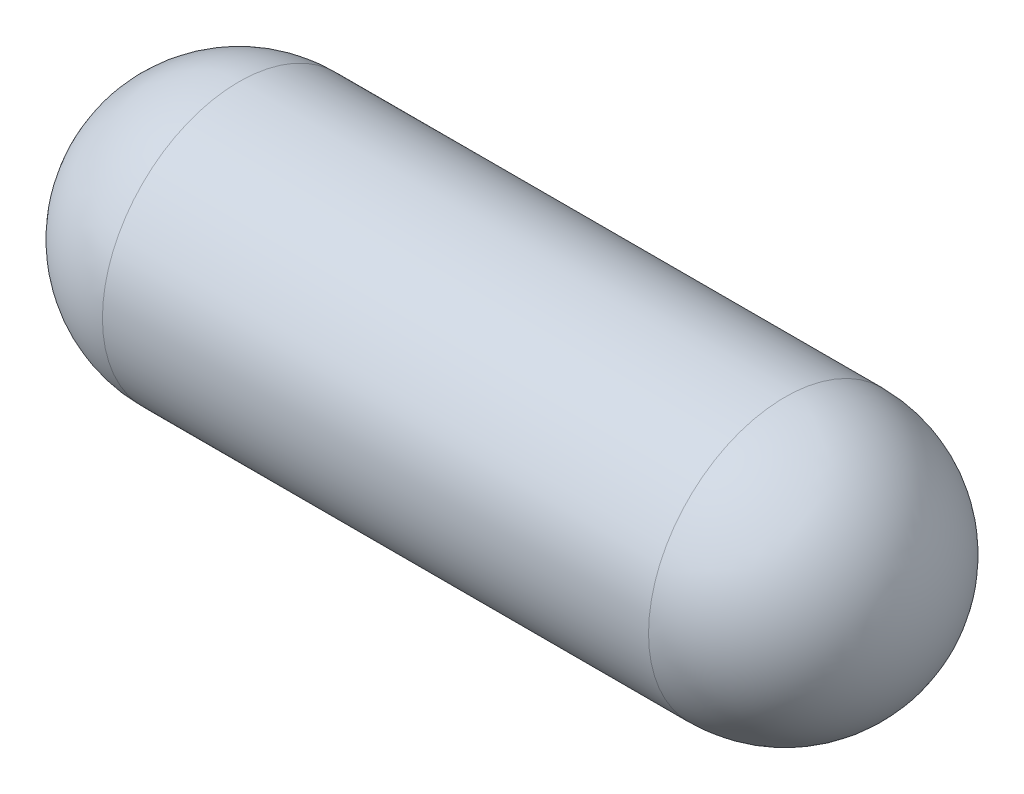
ISO-10303-21;
HEADER;
FILE_DESCRIPTION(('STEP AP214'),'2;1');
FILE_NAME('part.step','',(''),(''),'','','');
FILE_SCHEMA(('AUTOMOTIVE_DESIGN { 1 0 10303 214 1 1 1 1 }'));
ENDSEC;
DATA;
#1=APPLICATION_CONTEXT('core data for automotive mechanical design processes');
#2=APPLICATION_PROTOCOL_DEFINITION('international standard','automotive_design',2000,#1);
#3=PRODUCT_CONTEXT('',#1,'mechanical');
#4=PRODUCT('Part','Part','',(#3));
#5=PRODUCT_RELATED_PRODUCT_CATEGORY('part','',(#4));
#6=PRODUCT_DEFINITION_FORMATION('','',#4);
#7=PRODUCT_DEFINITION_CONTEXT('part definition',#1,'design');
#8=PRODUCT_DEFINITION('design','',#6,#7);
#9=PRODUCT_DEFINITION_SHAPE('','',#8);
#10=(LENGTH_UNIT() NAMED_UNIT(*) SI_UNIT(.MILLI.,.METRE.));
#11=(NAMED_UNIT(*) PLANE_ANGLE_UNIT() SI_UNIT($,.RADIAN.));
#12=(NAMED_UNIT(*) SI_UNIT($,.STERADIAN.) SOLID_ANGLE_UNIT());
#13=UNCERTAINTY_MEASURE_WITH_UNIT(LENGTH_MEASURE(1.E-05),#10,'distance_accuracy_value','');
#14=(GEOMETRIC_REPRESENTATION_CONTEXT(3) GLOBAL_UNCERTAINTY_ASSIGNED_CONTEXT((#13)) GLOBAL_UNIT_ASSIGNED_CONTEXT((#10,
#11,#12)) REPRESENTATION_CONTEXT('',''));
#15=CARTESIAN_POINT('',(0.,0.,0.));
#16=DIRECTION('',(0.,0.,1.));
#17=DIRECTION('',(1.,0.,0.));
#18=AXIS2_PLACEMENT_3D('',#15,#16,#17);
#19=CARTESIAN_POINT('',(3.175,0.,0.));
#20=DIRECTION('',(-1.,0.,0.));
#21=DIRECTION('',(0.,-1.,0.));
#22=AXIS2_PLACEMENT_3D('',#19,#20,#21);
#23=SPHERICAL_SURFACE('',#22,1.5875);
#24=CARTESIAN_POINT('',(3.175,0.,0.));
#25=DIRECTION('',(-1.,0.,0.));
#26=DIRECTION('',(0.,0.,1.));
#27=AXIS2_PLACEMENT_3D('',#24,#25,#26);
#28=CIRCLE('',#27,1.5875);
#29=CARTESIAN_POINT('',(3.175,0.,1.5875));
#30=VERTEX_POINT('',#29);
#31=EDGE_CURVE('E44',#30,#30,#28,.T.);
#32=ORIENTED_EDGE('',*,*,#31,.F.);
#33=EDGE_LOOP('',(#32));
#34=FACE_BOUND('',#33,.T.);
#35=ADVANCED_FACE('F37',(#34),#23,.T.);
#36=CARTESIAN_POINT('',(-3.175,0.,0.));
#37=DIRECTION('',(-1.,0.,0.));
#38=DIRECTION('',(0.,1.,0.));
#39=AXIS2_PLACEMENT_3D('',#36,#37,#38);
#40=SPHERICAL_SURFACE('',#39,1.5875);
#41=CARTESIAN_POINT('',(-3.175,0.,0.));
#42=DIRECTION('',(-1.,0.,0.));
#43=DIRECTION('',(0.,0.,1.));
#44=AXIS2_PLACEMENT_3D('',#41,#42,#43);
#45=CIRCLE('',#44,1.5875);
#46=CARTESIAN_POINT('',(-3.175,0.,1.5875));
#47=VERTEX_POINT('',#46);
#48=EDGE_CURVE('E10',#47,#47,#45,.T.);
#49=ORIENTED_EDGE('',*,*,#48,.T.);
#50=EDGE_LOOP('',(#49));
#51=FACE_BOUND('',#50,.T.);
#52=ADVANCED_FACE('F54',(#51),#40,.T.);
#53=CARTESIAN_POINT('',(-14.0842040249121,0.,0.));
#54=DIRECTION('',(-1.,0.,0.));
#55=DIRECTION('',(0.,0.,1.));
#56=AXIS2_PLACEMENT_3D('',#53,#54,#55);
#57=CYLINDRICAL_SURFACE('',#56,1.5875);
#58=ORIENTED_EDGE('',*,*,#48,.F.);
#59=EDGE_LOOP('',(#58));
#60=FACE_BOUND('',#59,.T.);
#61=ORIENTED_EDGE('',*,*,#31,.T.);
#62=EDGE_LOOP('',(#61));
#63=FACE_BOUND('',#62,.T.);
#64=ADVANCED_FACE('F51',(#60,#63),#57,.T.);
#65=CLOSED_SHELL('',(#35,#52,#64));
#66=MANIFOLD_SOLID_BREP('B2',#65);
#67=ADVANCED_BREP_SHAPE_REPRESENTATION('',(#18,#66),#14);
#68=SHAPE_DEFINITION_REPRESENTATION(#9,#67);
ENDSEC;
END-ISO-10303-21;
